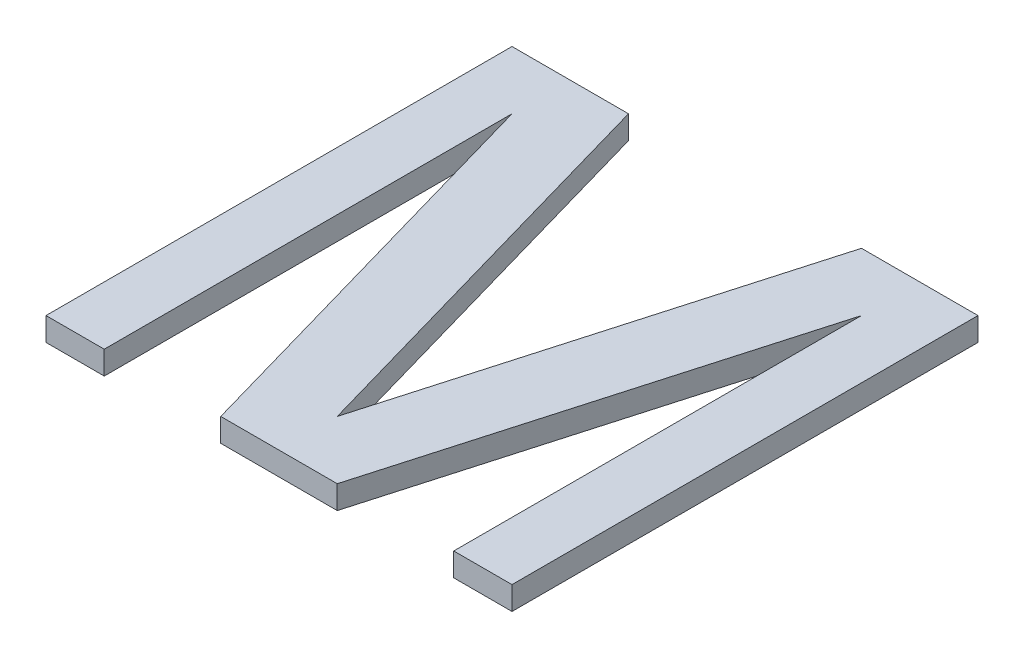
ISO-10303-21;
HEADER;
FILE_DESCRIPTION(('STEP AP214'),'2;1');
FILE_NAME('part.step','',(''),(''),'','','');
FILE_SCHEMA(('AUTOMOTIVE_DESIGN { 1 0 10303 214 1 1 1 1 }'));
ENDSEC;
DATA;
#1=APPLICATION_CONTEXT('core data for automotive mechanical design processes');
#2=APPLICATION_PROTOCOL_DEFINITION('international standard','automotive_design',2000,#1);
#3=PRODUCT_CONTEXT('',#1,'mechanical');
#4=PRODUCT('Part','Part','',(#3));
#5=PRODUCT_RELATED_PRODUCT_CATEGORY('part','',(#4));
#6=PRODUCT_DEFINITION_FORMATION('','',#4);
#7=PRODUCT_DEFINITION_CONTEXT('part definition',#1,'design');
#8=PRODUCT_DEFINITION('design','',#6,#7);
#9=PRODUCT_DEFINITION_SHAPE('','',#8);
#10=(LENGTH_UNIT() NAMED_UNIT(*) SI_UNIT(.MILLI.,.METRE.));
#11=(NAMED_UNIT(*) PLANE_ANGLE_UNIT() SI_UNIT($,.RADIAN.));
#12=(NAMED_UNIT(*) SI_UNIT($,.STERADIAN.) SOLID_ANGLE_UNIT());
#13=UNCERTAINTY_MEASURE_WITH_UNIT(LENGTH_MEASURE(1.E-05),#10,'distance_accuracy_value','');
#14=(GEOMETRIC_REPRESENTATION_CONTEXT(3) GLOBAL_UNCERTAINTY_ASSIGNED_CONTEXT((#13)) GLOBAL_UNIT_ASSIGNED_CONTEXT((#10,
#11,#12)) REPRESENTATION_CONTEXT('',''));
#15=CARTESIAN_POINT('',(0.,0.,0.));
#16=DIRECTION('',(0.,0.,1.));
#17=DIRECTION('',(1.,0.,0.));
#18=AXIS2_PLACEMENT_3D('',#15,#16,#17);
#19=CARTESIAN_POINT('',(15.8532252403674,2.,23.3062478064338));
#20=DIRECTION('',(0.,0.,-1.));
#21=DIRECTION('',(-1.,0.,0.));
#22=AXIS2_PLACEMENT_3D('',#19,#20,#21);
#23=PLANE('',#22);
#24=DIRECTION('',(1.,0.,0.));
#25=VECTOR('',#24,1.);
#26=CARTESIAN_POINT('',(15.8532252403674,0.,23.3062478064338));
#27=LINE('',#26,#25);
#28=CARTESIAN_POINT('',(15.8532252403674,0.,23.3062478064338));
#29=VERTEX_POINT('',#28);
#30=CARTESIAN_POINT('',(20.8532252403674,0.,23.3062478064338));
#31=VERTEX_POINT('',#30);
#32=EDGE_CURVE('E162',#29,#31,#27,.T.);
#33=ORIENTED_EDGE('',*,*,#32,.T.);
#34=DIRECTION('',(0.,-1.,0.));
#35=VECTOR('',#34,1.);
#36=CARTESIAN_POINT('',(20.8532252403674,2.,23.3062478064338));
#37=LINE('',#36,#35);
#38=CARTESIAN_POINT('',(20.8532252403674,2.,23.3062478064338));
#39=VERTEX_POINT('',#38);
#40=EDGE_CURVE('E11',#39,#31,#37,.T.);
#41=ORIENTED_EDGE('',*,*,#40,.F.);
#42=DIRECTION('',(1.,0.,0.));
#43=VECTOR('',#42,1.);
#44=CARTESIAN_POINT('',(15.8532252403674,2.,23.3062478064338));
#45=LINE('',#44,#43);
#46=CARTESIAN_POINT('',(15.8532252403674,2.,23.3062478064338));
#47=VERTEX_POINT('',#46);
#48=EDGE_CURVE('E188',#47,#39,#45,.T.);
#49=ORIENTED_EDGE('',*,*,#48,.F.);
#50=DIRECTION('',(0.,-1.,0.));
#51=VECTOR('',#50,1.);
#52=CARTESIAN_POINT('',(15.8532252403674,2.,23.3062478064338));
#53=LINE('',#52,#51);
#54=EDGE_CURVE('E158',#47,#29,#53,.T.);
#55=ORIENTED_EDGE('',*,*,#54,.T.);
#56=EDGE_LOOP('',(#33,#41,#49,#55));
#57=FACE_BOUND('',#56,.T.);
#58=ADVANCED_FACE('F35',(#57),#23,.F.);
#59=CARTESIAN_POINT('',(20.8532252403674,2.,-16.6937521935662));
#60=DIRECTION('',(-1.,0.,0.));
#61=DIRECTION('',(0.,0.,1.));
#62=AXIS2_PLACEMENT_3D('',#59,#60,#61);
#63=PLANE('',#62);
#64=DIRECTION('',(0.,0.,-1.));
#65=VECTOR('',#64,1.);
#66=CARTESIAN_POINT('',(20.8532252403674,0.,-16.6937521935662));
#67=LINE('',#66,#65);
#68=CARTESIAN_POINT('',(20.8532252403674,0.,-16.6937521935662));
#69=VERTEX_POINT('',#68);
#70=EDGE_CURVE('E165',#31,#69,#67,.T.);
#71=ORIENTED_EDGE('',*,*,#70,.T.);
#72=DIRECTION('',(0.,-1.,0.));
#73=VECTOR('',#72,1.);
#74=CARTESIAN_POINT('',(20.8532252403674,2.,-16.6937521935662));
#75=LINE('',#74,#73);
#76=CARTESIAN_POINT('',(20.8532252403674,2.,-16.6937521935662));
#77=VERTEX_POINT('',#76);
#78=EDGE_CURVE('E43',#77,#69,#75,.T.);
#79=ORIENTED_EDGE('',*,*,#78,.F.);
#80=DIRECTION('',(0.,0.,-1.));
#81=VECTOR('',#80,1.);
#82=CARTESIAN_POINT('',(20.8532252403674,2.,-16.6937521935662));
#83=LINE('',#82,#81);
#84=EDGE_CURVE('E107',#39,#77,#83,.T.);
#85=ORIENTED_EDGE('',*,*,#84,.F.);
#86=ORIENTED_EDGE('',*,*,#40,.T.);
#87=EDGE_LOOP('',(#71,#79,#85,#86));
#88=FACE_BOUND('',#87,.T.);
#89=ADVANCED_FACE('F260',(#88),#63,.F.);
#90=CARTESIAN_POINT('',(20.8532252403674,2.,-16.6937521935662));
#91=DIRECTION('',(0.,0.,1.));
#92=DIRECTION('',(1.,0.,0.));
#93=AXIS2_PLACEMENT_3D('',#90,#91,#92);
#94=PLANE('',#93);
#95=DIRECTION('',(-1.,0.,0.));
#96=VECTOR('',#95,1.);
#97=CARTESIAN_POINT('',(20.8532252403674,0.,-16.6937521935662));
#98=LINE('',#97,#96);
#99=CARTESIAN_POINT('',(10.8532252403674,0.,-16.6937521935662));
#100=VERTEX_POINT('',#99);
#101=EDGE_CURVE('E167',#69,#100,#98,.T.);
#102=ORIENTED_EDGE('',*,*,#101,.T.);
#103=DIRECTION('',(0.,-1.,0.));
#104=VECTOR('',#103,1.);
#105=CARTESIAN_POINT('',(10.8532252403674,2.,-16.6937521935662));
#106=LINE('',#105,#104);
#107=CARTESIAN_POINT('',(10.8532252403674,2.,-16.6937521935662));
#108=VERTEX_POINT('',#107);
#109=EDGE_CURVE('E210',#108,#100,#106,.T.);
#110=ORIENTED_EDGE('',*,*,#109,.F.);
#111=DIRECTION('',(-1.,0.,0.));
#112=VECTOR('',#111,1.);
#113=CARTESIAN_POINT('',(20.8532252403674,2.,-16.6937521935662));
#114=LINE('',#113,#112);
#115=EDGE_CURVE('E218',#77,#108,#114,.T.);
#116=ORIENTED_EDGE('',*,*,#115,.F.);
#117=ORIENTED_EDGE('',*,*,#78,.T.);
#118=EDGE_LOOP('',(#102,#110,#116,#117));
#119=FACE_BOUND('',#118,.T.);
#120=ADVANCED_FACE('F216',(#119),#94,.F.);
#121=CARTESIAN_POINT('',(0.853225240367428,2.,18.3062478064338));
#122=DIRECTION('',(0.961523947640823,0.,0.274721127897378));
#123=DIRECTION('',(0.274721127897378,0.,-0.961523947640823));
#124=AXIS2_PLACEMENT_3D('',#121,#122,#123);
#125=PLANE('',#124);
#126=DIRECTION('',(-0.274721127897378,0.,0.961523947640823));
#127=VECTOR('',#126,1.);
#128=CARTESIAN_POINT('',(0.853225240367428,0.,18.3062478064338));
#129=LINE('',#128,#127);
#130=CARTESIAN_POINT('',(0.853225240367428,0.,18.3062478064338));
#131=VERTEX_POINT('',#130);
#132=EDGE_CURVE('E169',#100,#131,#129,.T.);
#133=ORIENTED_EDGE('',*,*,#132,.T.);
#134=DIRECTION('',(0.,-1.,0.));
#135=VECTOR('',#134,1.);
#136=CARTESIAN_POINT('',(0.853225240367428,2.,18.3062478064338));
#137=LINE('',#136,#135);
#138=CARTESIAN_POINT('',(0.853225240367428,2.,18.3062478064338));
#139=VERTEX_POINT('',#138);
#140=EDGE_CURVE('E207',#139,#131,#137,.T.);
#141=ORIENTED_EDGE('',*,*,#140,.F.);
#142=DIRECTION('',(-0.274721127897378,0.,0.961523947640823));
#143=VECTOR('',#142,1.);
#144=CARTESIAN_POINT('',(0.853225240367428,2.,18.3062478064338));
#145=LINE('',#144,#143);
#146=EDGE_CURVE('E234',#108,#139,#145,.T.);
#147=ORIENTED_EDGE('',*,*,#146,.F.);
#148=ORIENTED_EDGE('',*,*,#109,.T.);
#149=EDGE_LOOP('',(#133,#141,#147,#148));
#150=FACE_BOUND('',#149,.T.);
#151=ADVANCED_FACE('F225',(#150),#125,.F.);
#152=CARTESIAN_POINT('',(-9.14677475963257,2.,-16.6937521935662));
#153=DIRECTION('',(-0.961523947640823,0.,0.274721127897378));
#154=DIRECTION('',(0.274721127897378,0.,0.961523947640823));
#155=AXIS2_PLACEMENT_3D('',#152,#153,#154);
#156=PLANE('',#155);
#157=DIRECTION('',(-0.274721127897378,0.,-0.961523947640823));
#158=VECTOR('',#157,1.);
#159=CARTESIAN_POINT('',(-9.14677475963257,0.,-16.6937521935662));
#160=LINE('',#159,#158);
#161=CARTESIAN_POINT('',(-9.14677475963257,0.,-16.6937521935662));
#162=VERTEX_POINT('',#161);
#163=EDGE_CURVE('E171',#131,#162,#160,.T.);
#164=ORIENTED_EDGE('',*,*,#163,.T.);
#165=DIRECTION('',(0.,-1.,0.));
#166=VECTOR('',#165,1.);
#167=CARTESIAN_POINT('',(-9.14677475963257,2.,-16.6937521935662));
#168=LINE('',#167,#166);
#169=CARTESIAN_POINT('',(-9.14677475963257,2.,-16.6937521935662));
#170=VERTEX_POINT('',#169);
#171=EDGE_CURVE('E204',#170,#162,#168,.T.);
#172=ORIENTED_EDGE('',*,*,#171,.F.);
#173=DIRECTION('',(-0.274721127897378,0.,-0.961523947640823));
#174=VECTOR('',#173,1.);
#175=CARTESIAN_POINT('',(-9.14677475963257,2.,-16.6937521935662));
#176=LINE('',#175,#174);
#177=EDGE_CURVE('E231',#139,#170,#176,.T.);
#178=ORIENTED_EDGE('',*,*,#177,.F.);
#179=ORIENTED_EDGE('',*,*,#140,.T.);
#180=EDGE_LOOP('',(#164,#172,#178,#179));
#181=FACE_BOUND('',#180,.T.);
#182=ADVANCED_FACE('F229',(#181),#156,.F.);
#183=CARTESIAN_POINT('',(-19.1467747596326,2.,-16.6937521935662));
#184=DIRECTION('',(0.,0.,1.));
#185=DIRECTION('',(1.,0.,0.));
#186=AXIS2_PLACEMENT_3D('',#183,#184,#185);
#187=PLANE('',#186);
#188=DIRECTION('',(-1.,0.,0.));
#189=VECTOR('',#188,1.);
#190=CARTESIAN_POINT('',(-19.1467747596326,0.,-16.6937521935662));
#191=LINE('',#190,#189);
#192=CARTESIAN_POINT('',(-19.1467747596326,0.,-16.6937521935662));
#193=VERTEX_POINT('',#192);
#194=EDGE_CURVE('E173',#162,#193,#191,.T.);
#195=ORIENTED_EDGE('',*,*,#194,.T.);
#196=DIRECTION('',(0.,-1.,0.));
#197=VECTOR('',#196,1.);
#198=CARTESIAN_POINT('',(-19.1467747596326,2.,-16.6937521935662));
#199=LINE('',#198,#197);
#200=CARTESIAN_POINT('',(-19.1467747596326,2.,-16.6937521935662));
#201=VERTEX_POINT('',#200);
#202=EDGE_CURVE('E201',#201,#193,#199,.T.);
#203=ORIENTED_EDGE('',*,*,#202,.F.);
#204=DIRECTION('',(-1.,0.,0.));
#205=VECTOR('',#204,1.);
#206=CARTESIAN_POINT('',(-19.1467747596326,2.,-16.6937521935662));
#207=LINE('',#206,#205);
#208=EDGE_CURVE('E233',#170,#201,#207,.T.);
#209=ORIENTED_EDGE('',*,*,#208,.F.);
#210=ORIENTED_EDGE('',*,*,#171,.T.);
#211=EDGE_LOOP('',(#195,#203,#209,#210));
#212=FACE_BOUND('',#211,.T.);
#213=ADVANCED_FACE('F272',(#212),#187,.F.);
#214=CARTESIAN_POINT('',(-19.1467747596326,2.,-16.6937521935662));
#215=DIRECTION('',(1.,0.,0.));
#216=DIRECTION('',(0.,0.,-1.));
#217=AXIS2_PLACEMENT_3D('',#214,#215,#216);
#218=PLANE('',#217);
#219=DIRECTION('',(0.,0.,1.));
#220=VECTOR('',#219,1.);
#221=CARTESIAN_POINT('',(-19.1467747596326,0.,-16.6937521935662));
#222=LINE('',#221,#220);
#223=CARTESIAN_POINT('',(-19.1467747596326,0.,23.3062478064338));
#224=VERTEX_POINT('',#223);
#225=EDGE_CURVE('E175',#193,#224,#222,.T.);
#226=ORIENTED_EDGE('',*,*,#225,.T.);
#227=DIRECTION('',(0.,-1.,0.));
#228=VECTOR('',#227,1.);
#229=CARTESIAN_POINT('',(-19.1467747596326,2.,23.3062478064338));
#230=LINE('',#229,#228);
#231=CARTESIAN_POINT('',(-19.1467747596326,2.,23.3062478064338));
#232=VERTEX_POINT('',#231);
#233=EDGE_CURVE('E198',#232,#224,#230,.T.);
#234=ORIENTED_EDGE('',*,*,#233,.F.);
#235=DIRECTION('',(0.,0.,1.));
#236=VECTOR('',#235,1.);
#237=CARTESIAN_POINT('',(-19.1467747596326,2.,-16.6937521935662));
#238=LINE('',#237,#236);
#239=EDGE_CURVE('E236',#201,#232,#238,.T.);
#240=ORIENTED_EDGE('',*,*,#239,.F.);
#241=ORIENTED_EDGE('',*,*,#202,.T.);
#242=EDGE_LOOP('',(#226,#234,#240,#241));
#243=FACE_BOUND('',#242,.T.);
#244=ADVANCED_FACE('F275',(#243),#218,.F.);
#245=CARTESIAN_POINT('',(-19.1467747596326,2.,23.3062478064338));
#246=DIRECTION('',(0.,0.,-1.));
#247=DIRECTION('',(-1.,0.,0.));
#248=AXIS2_PLACEMENT_3D('',#245,#246,#247);
#249=PLANE('',#248);
#250=DIRECTION('',(1.,0.,0.));
#251=VECTOR('',#250,1.);
#252=CARTESIAN_POINT('',(-19.1467747596326,0.,23.3062478064338));
#253=LINE('',#252,#251);
#254=CARTESIAN_POINT('',(-14.1467747596326,0.,23.3062478064338));
#255=VERTEX_POINT('',#254);
#256=EDGE_CURVE('E177',#224,#255,#253,.T.);
#257=ORIENTED_EDGE('',*,*,#256,.T.);
#258=DIRECTION('',(0.,-1.,0.));
#259=VECTOR('',#258,1.);
#260=CARTESIAN_POINT('',(-14.1467747596326,2.,23.3062478064338));
#261=LINE('',#260,#259);
#262=CARTESIAN_POINT('',(-14.1467747596326,2.,23.3062478064338));
#263=VERTEX_POINT('',#262);
#264=EDGE_CURVE('E195',#263,#255,#261,.T.);
#265=ORIENTED_EDGE('',*,*,#264,.F.);
#266=DIRECTION('',(1.,0.,0.));
#267=VECTOR('',#266,1.);
#268=CARTESIAN_POINT('',(-19.1467747596326,2.,23.3062478064338));
#269=LINE('',#268,#267);
#270=EDGE_CURVE('E242',#232,#263,#269,.T.);
#271=ORIENTED_EDGE('',*,*,#270,.F.);
#272=ORIENTED_EDGE('',*,*,#233,.T.);
#273=EDGE_LOOP('',(#257,#265,#271,#272));
#274=FACE_BOUND('',#273,.T.);
#275=ADVANCED_FACE('F279',(#274),#249,.F.);
#276=CARTESIAN_POINT('',(-14.1467747596326,2.,-11.6937521935662));
#277=DIRECTION('',(-1.,0.,0.));
#278=DIRECTION('',(0.,0.,1.));
#279=AXIS2_PLACEMENT_3D('',#276,#277,#278);
#280=PLANE('',#279);
#281=DIRECTION('',(0.,0.,-1.));
#282=VECTOR('',#281,1.);
#283=CARTESIAN_POINT('',(-14.1467747596326,0.,-11.6937521935662));
#284=LINE('',#283,#282);
#285=CARTESIAN_POINT('',(-14.1467747596326,0.,-11.6937521935662));
#286=VERTEX_POINT('',#285);
#287=EDGE_CURVE('E180',#255,#286,#284,.T.);
#288=ORIENTED_EDGE('',*,*,#287,.T.);
#289=DIRECTION('',(0.,-1.,0.));
#290=VECTOR('',#289,1.);
#291=CARTESIAN_POINT('',(-14.1467747596326,2.,-11.6937521935662));
#292=LINE('',#291,#290);
#293=CARTESIAN_POINT('',(-14.1467747596326,2.,-11.6937521935662));
#294=VERTEX_POINT('',#293);
#295=EDGE_CURVE('E192',#294,#286,#292,.T.);
#296=ORIENTED_EDGE('',*,*,#295,.F.);
#297=DIRECTION('',(0.,0.,-1.));
#298=VECTOR('',#297,1.);
#299=CARTESIAN_POINT('',(-14.1467747596326,2.,18.3062478064338));
#300=LINE('',#299,#298);
#301=EDGE_CURVE('E244',#263,#294,#300,.T.);
#302=ORIENTED_EDGE('',*,*,#301,.F.);
#303=ORIENTED_EDGE('',*,*,#264,.T.);
#304=EDGE_LOOP('',(#288,#296,#302,#303));
#305=FACE_BOUND('',#304,.T.);
#306=ADVANCED_FACE('F250',(#305),#280,.F.);
#307=CARTESIAN_POINT('',(-14.1467747596326,2.,-11.6937521935662));
#308=DIRECTION('',(0.961523947640823,0.,-0.274721127897378));
#309=DIRECTION('',(-0.274721127897378,0.,-0.961523947640823));
#310=AXIS2_PLACEMENT_3D('',#307,#308,#309);
#311=PLANE('',#310);
#312=DIRECTION('',(0.274721127897378,0.,0.961523947640823));
#313=VECTOR('',#312,1.);
#314=CARTESIAN_POINT('',(-14.1467747596326,0.,-11.6937521935662));
#315=LINE('',#314,#313);
#316=CARTESIAN_POINT('',(-4.14677475963257,0.,23.3062478064338));
#317=VERTEX_POINT('',#316);
#318=EDGE_CURVE('E182',#286,#317,#315,.T.);
#319=ORIENTED_EDGE('',*,*,#318,.T.);
#320=DIRECTION('',(0.,-1.,0.));
#321=VECTOR('',#320,1.);
#322=CARTESIAN_POINT('',(-4.14677475963257,2.,23.3062478064338));
#323=LINE('',#322,#321);
#324=CARTESIAN_POINT('',(-4.14677475963257,2.,23.3062478064338));
#325=VERTEX_POINT('',#324);
#326=EDGE_CURVE('E153',#325,#317,#323,.T.);
#327=ORIENTED_EDGE('',*,*,#326,.F.);
#328=DIRECTION('',(0.274721127897378,0.,0.961523947640823));
#329=VECTOR('',#328,1.);
#330=CARTESIAN_POINT('',(-14.1467747596326,2.,-11.6937521935662));
#331=LINE('',#330,#329);
#332=EDGE_CURVE('E142',#294,#325,#331,.T.);
#333=ORIENTED_EDGE('',*,*,#332,.F.);
#334=ORIENTED_EDGE('',*,*,#295,.T.);
#335=EDGE_LOOP('',(#319,#327,#333,#334));
#336=FACE_BOUND('',#335,.T.);
#337=ADVANCED_FACE('F253',(#336),#311,.F.);
#338=CARTESIAN_POINT('',(-4.14677475963257,2.,23.3062478064338));
#339=DIRECTION('',(0.,0.,-1.));
#340=DIRECTION('',(-1.,0.,0.));
#341=AXIS2_PLACEMENT_3D('',#338,#339,#340);
#342=PLANE('',#341);
#343=DIRECTION('',(1.,0.,0.));
#344=VECTOR('',#343,1.);
#345=CARTESIAN_POINT('',(-4.14677475963257,0.,23.3062478064338));
#346=LINE('',#345,#344);
#347=CARTESIAN_POINT('',(5.85322524036743,0.,23.3062478064338));
#348=VERTEX_POINT('',#347);
#349=EDGE_CURVE('E151',#317,#348,#346,.T.);
#350=ORIENTED_EDGE('',*,*,#349,.T.);
#351=DIRECTION('',(0.,-1.,0.));
#352=VECTOR('',#351,1.);
#353=CARTESIAN_POINT('',(5.85322524036743,2.,23.3062478064338));
#354=LINE('',#353,#352);
#355=CARTESIAN_POINT('',(5.85322524036743,2.,23.3062478064338));
#356=VERTEX_POINT('',#355);
#357=EDGE_CURVE('E148',#356,#348,#354,.T.);
#358=ORIENTED_EDGE('',*,*,#357,.F.);
#359=DIRECTION('',(1.,0.,0.));
#360=VECTOR('',#359,1.);
#361=CARTESIAN_POINT('',(-4.14677475963257,2.,23.3062478064338));
#362=LINE('',#361,#360);
#363=EDGE_CURVE('E135',#325,#356,#362,.T.);
#364=ORIENTED_EDGE('',*,*,#363,.F.);
#365=ORIENTED_EDGE('',*,*,#326,.T.);
#366=EDGE_LOOP('',(#350,#358,#364,#365));
#367=FACE_BOUND('',#366,.T.);
#368=ADVANCED_FACE('F149',(#367),#342,.F.);
#369=CARTESIAN_POINT('',(15.8532252403674,2.,-11.6937521935662));
#370=DIRECTION('',(-0.961523947640823,0.,-0.274721127897378));
#371=DIRECTION('',(-0.274721127897378,0.,0.961523947640823));
#372=AXIS2_PLACEMENT_3D('',#369,#370,#371);
#373=PLANE('',#372);
#374=DIRECTION('',(0.274721127897378,0.,-0.961523947640823));
#375=VECTOR('',#374,1.);
#376=CARTESIAN_POINT('',(15.8532252403674,0.,-11.6937521935662));
#377=LINE('',#376,#375);
#378=CARTESIAN_POINT('',(15.8532252403674,0.,-11.6937521935662));
#379=VERTEX_POINT('',#378);
#380=EDGE_CURVE('E185',#348,#379,#377,.T.);
#381=ORIENTED_EDGE('',*,*,#380,.T.);
#382=DIRECTION('',(0.,-1.,0.));
#383=VECTOR('',#382,1.);
#384=CARTESIAN_POINT('',(15.8532252403674,2.,-11.6937521935662));
#385=LINE('',#384,#383);
#386=CARTESIAN_POINT('',(15.8532252403674,2.,-11.6937521935662));
#387=VERTEX_POINT('',#386);
#388=EDGE_CURVE('E154',#387,#379,#385,.T.);
#389=ORIENTED_EDGE('',*,*,#388,.F.);
#390=DIRECTION('',(0.274721127897378,0.,-0.961523947640823));
#391=VECTOR('',#390,1.);
#392=CARTESIAN_POINT('',(15.8532252403674,2.,-11.6937521935662));
#393=LINE('',#392,#391);
#394=EDGE_CURVE('E139',#356,#387,#393,.T.);
#395=ORIENTED_EDGE('',*,*,#394,.F.);
#396=ORIENTED_EDGE('',*,*,#357,.T.);
#397=EDGE_LOOP('',(#381,#389,#395,#396));
#398=FACE_BOUND('',#397,.T.);
#399=ADVANCED_FACE('F156',(#398),#373,.F.);
#400=CARTESIAN_POINT('',(15.8532252403674,2.,18.3062478064338));
#401=DIRECTION('',(1.,0.,0.));
#402=DIRECTION('',(0.,0.,-1.));
#403=AXIS2_PLACEMENT_3D('',#400,#401,#402);
#404=PLANE('',#403);
#405=DIRECTION('',(0.,0.,1.));
#406=VECTOR('',#405,1.);
#407=CARTESIAN_POINT('',(15.8532252403674,0.,18.3062478064338));
#408=LINE('',#407,#406);
#409=EDGE_CURVE('E95',#379,#29,#408,.T.);
#410=ORIENTED_EDGE('',*,*,#409,.T.);
#411=ORIENTED_EDGE('',*,*,#54,.F.);
#412=DIRECTION('',(0.,0.,1.));
#413=VECTOR('',#412,1.);
#414=CARTESIAN_POINT('',(15.8532252403674,2.,-11.6937521935662));
#415=LINE('',#414,#413);
#416=EDGE_CURVE('E51',#387,#47,#415,.T.);
#417=ORIENTED_EDGE('',*,*,#416,.F.);
#418=ORIENTED_EDGE('',*,*,#388,.T.);
#419=EDGE_LOOP('',(#410,#411,#417,#418));
#420=FACE_BOUND('',#419,.T.);
#421=ADVANCED_FACE('F254',(#420),#404,.F.);
#422=CARTESIAN_POINT('',(0.,2.,0.));
#423=DIRECTION('',(0.,-1.,0.));
#424=DIRECTION('',(0.,0.,-1.));
#425=AXIS2_PLACEMENT_3D('',#422,#423,#424);
#426=PLANE('',#425);
#427=ORIENTED_EDGE('',*,*,#48,.T.);
#428=ORIENTED_EDGE('',*,*,#84,.T.);
#429=ORIENTED_EDGE('',*,*,#115,.T.);
#430=ORIENTED_EDGE('',*,*,#146,.T.);
#431=ORIENTED_EDGE('',*,*,#177,.T.);
#432=ORIENTED_EDGE('',*,*,#208,.T.);
#433=ORIENTED_EDGE('',*,*,#239,.T.);
#434=ORIENTED_EDGE('',*,*,#270,.T.);
#435=ORIENTED_EDGE('',*,*,#301,.T.);
#436=ORIENTED_EDGE('',*,*,#332,.T.);
#437=ORIENTED_EDGE('',*,*,#363,.T.);
#438=ORIENTED_EDGE('',*,*,#394,.T.);
#439=ORIENTED_EDGE('',*,*,#416,.T.);
#440=EDGE_LOOP('',(#427,#428,#429,#430,#431,#432,#433,#434,#435,#436,#437,#438,#439));
#441=FACE_BOUND('',#440,.T.);
#442=ADVANCED_FACE('F137',(#441),#426,.F.);
#443=CARTESIAN_POINT('',(0.,0.,0.));
#444=DIRECTION('',(0.,-1.,0.));
#445=DIRECTION('',(0.,0.,-1.));
#446=AXIS2_PLACEMENT_3D('',#443,#444,#445);
#447=PLANE('',#446);
#448=ORIENTED_EDGE('',*,*,#32,.F.);
#449=ORIENTED_EDGE('',*,*,#409,.F.);
#450=ORIENTED_EDGE('',*,*,#380,.F.);
#451=ORIENTED_EDGE('',*,*,#349,.F.);
#452=ORIENTED_EDGE('',*,*,#318,.F.);
#453=ORIENTED_EDGE('',*,*,#287,.F.);
#454=ORIENTED_EDGE('',*,*,#256,.F.);
#455=ORIENTED_EDGE('',*,*,#225,.F.);
#456=ORIENTED_EDGE('',*,*,#194,.F.);
#457=ORIENTED_EDGE('',*,*,#163,.F.);
#458=ORIENTED_EDGE('',*,*,#132,.F.);
#459=ORIENTED_EDGE('',*,*,#101,.F.);
#460=ORIENTED_EDGE('',*,*,#70,.F.);
#461=EDGE_LOOP('',(#448,#449,#450,#451,#452,#453,#454,#455,#456,#457,#458,#459,#460));
#462=FACE_BOUND('',#461,.T.);
#463=ADVANCED_FACE('F220',(#462),#447,.T.);
#464=CLOSED_SHELL('',(#58,#89,#120,#151,#182,#213,#244,#275,#306,#337,#368,#399,#421,#442,#463));
#465=MANIFOLD_SOLID_BREP('B2',#464);
#466=ADVANCED_BREP_SHAPE_REPRESENTATION('',(#18,#465),#14);
#467=SHAPE_DEFINITION_REPRESENTATION(#9,#466);
ENDSEC;
END-ISO-10303-21;
